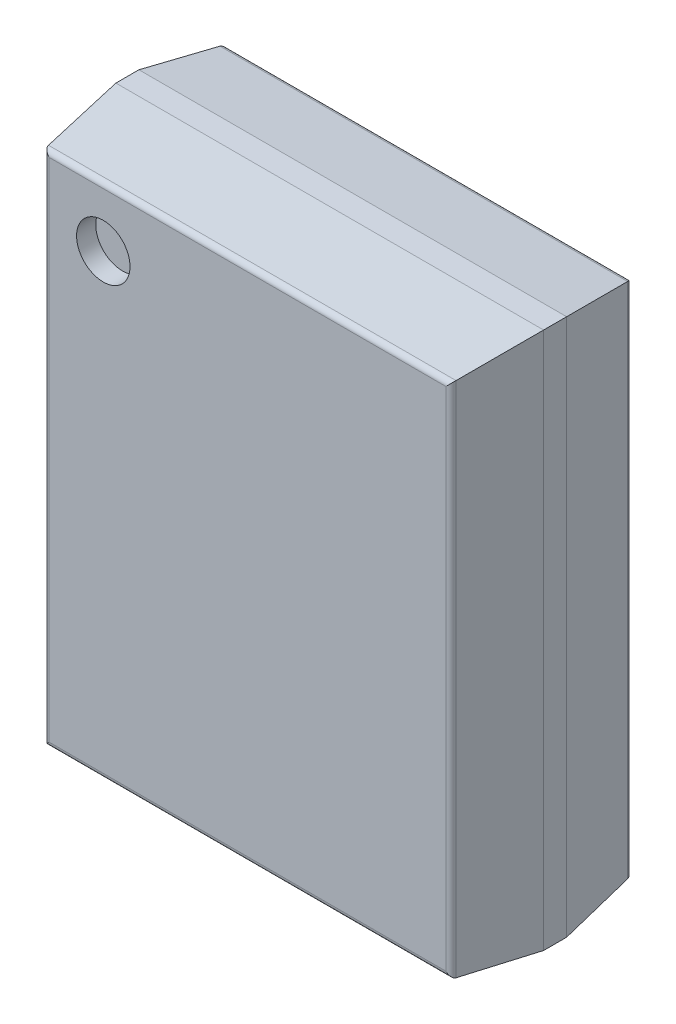
ISO-10303-21;
HEADER;
FILE_DESCRIPTION(('STEP AP214'),'2;1');
FILE_NAME('part.step','',(''),(''),'','','');
FILE_SCHEMA(('AUTOMOTIVE_DESIGN { 1 0 10303 214 1 1 1 1 }'));
ENDSEC;
DATA;
#1=APPLICATION_CONTEXT('core data for automotive mechanical design processes');
#2=APPLICATION_PROTOCOL_DEFINITION('international standard','automotive_design',2000,#1);
#3=PRODUCT_CONTEXT('',#1,'mechanical');
#4=PRODUCT('Part','Part','',(#3));
#5=PRODUCT_RELATED_PRODUCT_CATEGORY('part','',(#4));
#6=PRODUCT_DEFINITION_FORMATION('','',#4);
#7=PRODUCT_DEFINITION_CONTEXT('part definition',#1,'design');
#8=PRODUCT_DEFINITION('design','',#6,#7);
#9=PRODUCT_DEFINITION_SHAPE('','',#8);
#10=(LENGTH_UNIT() NAMED_UNIT(*) SI_UNIT(.MILLI.,.METRE.));
#11=(NAMED_UNIT(*) PLANE_ANGLE_UNIT() SI_UNIT($,.RADIAN.));
#12=(NAMED_UNIT(*) SI_UNIT($,.STERADIAN.) SOLID_ANGLE_UNIT());
#13=UNCERTAINTY_MEASURE_WITH_UNIT(LENGTH_MEASURE(1.E-05),#10,'distance_accuracy_value','');
#14=(GEOMETRIC_REPRESENTATION_CONTEXT(3) GLOBAL_UNCERTAINTY_ASSIGNED_CONTEXT((#13)) GLOBAL_UNIT_ASSIGNED_CONTEXT((#10,
#11,#12)) REPRESENTATION_CONTEXT('',''));
#15=CARTESIAN_POINT('',(0.,0.,0.));
#16=DIRECTION('',(0.,0.,1.));
#17=DIRECTION('',(1.,0.,0.));
#18=AXIS2_PLACEMENT_3D('',#15,#16,#17);
#19=CARTESIAN_POINT('',(-1.315,1.815,1.575));
#20=DIRECTION('',(0.,0.,1.));
#21=DIRECTION('',(1.,0.,0.));
#22=AXIS2_PLACEMENT_3D('',#19,#20,#21);
#23=PLANE('',#22);
#24=CARTESIAN_POINT('',(-1.315,1.815,1.575));
#25=DIRECTION('',(0.,0.,1.));
#26=DIRECTION('',(1.,0.,0.));
#27=AXIS2_PLACEMENT_3D('',#24,#25,#26);
#28=CIRCLE('',#27,0.24375);
#29=CARTESIAN_POINT('',(-1.07125,1.815,1.575));
#30=VERTEX_POINT('',#29);
#31=EDGE_CURVE('E20',#30,#30,#28,.T.);
#32=ORIENTED_EDGE('',*,*,#31,.T.);
#33=EDGE_LOOP('',(#32));
#34=FACE_BOUND('',#33,.T.);
#35=ADVANCED_FACE('F17',(#34),#23,.T.);
#36=CARTESIAN_POINT('',(-1.315,1.815,1.575));
#37=DIRECTION('',(0.,0.,1.));
#38=DIRECTION('',(1.,0.,0.));
#39=AXIS2_PLACEMENT_3D('',#36,#37,#38);
#40=CYLINDRICAL_SURFACE('',#39,0.24375);
#41=CARTESIAN_POINT('',(-1.315,1.815,1.75));
#42=DIRECTION('',(0.,0.,1.));
#43=DIRECTION('',(1.,0.,0.));
#44=AXIS2_PLACEMENT_3D('',#41,#42,#43);
#45=CIRCLE('',#44,0.24375);
#46=CARTESIAN_POINT('',(-1.07125,1.815,1.75));
#47=VERTEX_POINT('',#46);
#48=EDGE_CURVE('E100',#47,#47,#45,.F.);
#49=ORIENTED_EDGE('',*,*,#48,.F.);
#50=EDGE_LOOP('',(#49));
#51=FACE_BOUND('',#50,.T.);
#52=ORIENTED_EDGE('',*,*,#31,.F.);
#53=EDGE_LOOP('',(#52));
#54=FACE_BOUND('',#53,.T.);
#55=ADVANCED_FACE('F117',(#51,#54),#40,.F.);
#56=CARTESIAN_POINT('',(-1.95,-2.45,1.75));
#57=DIRECTION('',(0.,0.,1.));
#58=DIRECTION('',(1.,0.,0.));
#59=AXIS2_PLACEMENT_3D('',#56,#57,#58);
#60=PLANE('',#59);
#61=ORIENTED_EDGE('',*,*,#48,.T.);
#62=EDGE_LOOP('',(#61));
#63=FACE_BOUND('',#62,.T.);
#64=DIRECTION('',(0.,1.,0.));
#65=VECTOR('',#64,1.);
#66=CARTESIAN_POINT('',(1.808580992189,-2.3525,1.75));
#67=LINE('',#66,#65);
#68=CARTESIAN_POINT('',(1.808580992189,2.308580992189,1.75));
#69=VERTEX_POINT('',#68);
#70=CARTESIAN_POINT('',(1.808580992189,-2.308580992189,1.75));
#71=VERTEX_POINT('',#70);
#72=EDGE_CURVE('E107',#69,#71,#67,.F.);
#73=ORIENTED_EDGE('',*,*,#72,.F.);
#74=DIRECTION('',(1.,0.,0.));
#75=VECTOR('',#74,1.);
#76=CARTESIAN_POINT('',(-1.8525,2.308580992189,1.75));
#77=LINE('',#76,#75);
#78=CARTESIAN_POINT('',(-1.808580992189,2.308580992189,1.75));
#79=VERTEX_POINT('',#78);
#80=EDGE_CURVE('E96',#79,#69,#77,.T.);
#81=ORIENTED_EDGE('',*,*,#80,.F.);
#82=DIRECTION('',(0.,1.,0.));
#83=VECTOR('',#82,1.);
#84=CARTESIAN_POINT('',(-1.808580992189,-2.3525,1.75));
#85=LINE('',#84,#83);
#86=CARTESIAN_POINT('',(-1.808580992189,-2.308580992189,1.75));
#87=VERTEX_POINT('',#86);
#88=EDGE_CURVE('E92',#87,#79,#85,.T.);
#89=ORIENTED_EDGE('',*,*,#88,.F.);
#90=DIRECTION('',(1.,0.,0.));
#91=VECTOR('',#90,1.);
#92=CARTESIAN_POINT('',(-1.8525,-2.308580992189,1.75));
#93=LINE('',#92,#91);
#94=EDGE_CURVE('E81',#71,#87,#93,.F.);
#95=ORIENTED_EDGE('',*,*,#94,.F.);
#96=EDGE_LOOP('',(#73,#81,#89,#95));
#97=FACE_BOUND('',#96,.T.);
#98=ADVANCED_FACE('F95',(#63,#97),#60,.T.);
#99=CARTESIAN_POINT('',(-1.808580992189,-2.3525,1.7));
#100=DIRECTION('',(0.,1.,0.));
#101=DIRECTION('',(0.,0.,1.));
#102=AXIS2_PLACEMENT_3D('',#99,#100,#101);
#103=CYLINDRICAL_SURFACE('',#102,0.05);
#104=CARTESIAN_POINT('',(-1.808580992189,2.308580992189,1.7));
#105=DIRECTION('',(0.707106781186547,0.707106781186547,0.));
#106=DIRECTION('',(0.707106781186547,-0.707106781186547,0.));
#107=AXIS2_PLACEMENT_3D('',#104,#105,#106);
#108=ELLIPSE('',#107,0.0707106781186548,0.05);
#109=CARTESIAN_POINT('',(-1.85816352239675,2.35816352239655,1.70644768937089));
#110=VERTEX_POINT('',#109);
#111=EDGE_CURVE('E363',#110,#79,#108,.T.);
#112=ORIENTED_EDGE('',*,*,#111,.F.);
#113=DIRECTION('',(0.,1.,0.));
#114=VECTOR('',#113,1.);
#115=CARTESIAN_POINT('',(-1.8581635223966,-2.45,1.70644768937095));
#116=LINE('',#115,#114);
#117=CARTESIAN_POINT('',(-1.85816352239675,-2.35816352239655,1.70644768937089));
#118=VERTEX_POINT('',#117);
#119=EDGE_CURVE('E104',#110,#118,#116,.F.);
#120=ORIENTED_EDGE('',*,*,#119,.T.);
#121=CARTESIAN_POINT('',(-1.808580992189,-2.308580992189,1.7));
#122=DIRECTION('',(0.707106781186547,-0.707106781186547,0.));
#123=DIRECTION('',(0.707106781186547,0.707106781186547,0.));
#124=AXIS2_PLACEMENT_3D('',#121,#122,#123);
#125=ELLIPSE('',#124,0.0707106781186548,0.05);
#126=EDGE_CURVE('E86',#87,#118,#125,.T.);
#127=ORIENTED_EDGE('',*,*,#126,.F.);
#128=ORIENTED_EDGE('',*,*,#88,.T.);
#129=EDGE_LOOP('',(#112,#120,#127,#128));
#130=FACE_BOUND('',#129,.T.);
#131=ADVANCED_FACE('F103',(#130),#103,.T.);
#132=CARTESIAN_POINT('',(-1.8525,-2.308580992189,1.7));
#133=DIRECTION('',(1.,0.,0.));
#134=DIRECTION('',(0.,0.,-1.));
#135=AXIS2_PLACEMENT_3D('',#132,#133,#134);
#136=CYLINDRICAL_SURFACE('',#135,0.05);
#137=ORIENTED_EDGE('',*,*,#94,.T.);
#138=ORIENTED_EDGE('',*,*,#126,.T.);
#139=DIRECTION('',(1.,0.,0.));
#140=VECTOR('',#139,1.);
#141=CARTESIAN_POINT('',(-1.95,-2.3581635223966,1.70644768937095));
#142=LINE('',#141,#140);
#143=CARTESIAN_POINT('',(1.85816352239655,-2.35816352239675,1.70644768937089));
#144=VERTEX_POINT('',#143);
#145=EDGE_CURVE('E380',#118,#144,#142,.T.);
#146=ORIENTED_EDGE('',*,*,#145,.T.);
#147=CARTESIAN_POINT('',(1.808580992189,-2.308580992189,1.7));
#148=DIRECTION('',(0.707106781186547,0.707106781186547,0.));
#149=DIRECTION('',(-0.707106781186547,0.707106781186547,0.));
#150=AXIS2_PLACEMENT_3D('',#147,#148,#149);
#151=ELLIPSE('',#150,0.0707106781186548,0.05);
#152=EDGE_CURVE('E88',#71,#144,#151,.T.);
#153=ORIENTED_EDGE('',*,*,#152,.F.);
#154=EDGE_LOOP('',(#137,#138,#146,#153));
#155=FACE_BOUND('',#154,.T.);
#156=ADVANCED_FACE('F83',(#155),#136,.T.);
#157=CARTESIAN_POINT('',(1.808580992189,-2.3525,1.7));
#158=DIRECTION('',(0.,1.,0.));
#159=DIRECTION('',(0.,0.,1.));
#160=AXIS2_PLACEMENT_3D('',#157,#158,#159);
#161=CYLINDRICAL_SURFACE('',#160,0.05);
#162=CARTESIAN_POINT('',(1.808580992189,2.308580992189,1.7));
#163=DIRECTION('',(0.707106781186547,-0.707106781186547,0.));
#164=DIRECTION('',(0.707106781186547,0.707106781186547,0.));
#165=AXIS2_PLACEMENT_3D('',#162,#163,#164);
#166=ELLIPSE('',#165,0.0707106781186548,0.05);
#167=CARTESIAN_POINT('',(1.85816352239675,2.35816352239655,1.70644768937089));
#168=VERTEX_POINT('',#167);
#169=EDGE_CURVE('E357',#69,#168,#166,.F.);
#170=ORIENTED_EDGE('',*,*,#169,.F.);
#171=ORIENTED_EDGE('',*,*,#72,.T.);
#172=ORIENTED_EDGE('',*,*,#152,.T.);
#173=DIRECTION('',(0.,1.,0.));
#174=VECTOR('',#173,1.);
#175=CARTESIAN_POINT('',(1.8581635223966,-2.45,1.70644768937095));
#176=LINE('',#175,#174);
#177=EDGE_CURVE('E359',#168,#144,#176,.F.);
#178=ORIENTED_EDGE('',*,*,#177,.F.);
#179=EDGE_LOOP('',(#170,#171,#172,#178));
#180=FACE_BOUND('',#179,.T.);
#181=ADVANCED_FACE('F200',(#180),#161,.T.);
#182=CARTESIAN_POINT('',(-1.8525,2.308580992189,1.7));
#183=DIRECTION('',(1.,0.,0.));
#184=DIRECTION('',(0.,0.,-1.));
#185=AXIS2_PLACEMENT_3D('',#182,#183,#184);
#186=CYLINDRICAL_SURFACE('',#185,0.05);
#187=DIRECTION('',(1.,0.,0.));
#188=VECTOR('',#187,1.);
#189=CARTESIAN_POINT('',(-1.95,2.3581635223966,1.70644768937095));
#190=LINE('',#189,#188);
#191=EDGE_CURVE('E385',#110,#168,#190,.T.);
#192=ORIENTED_EDGE('',*,*,#191,.F.);
#193=ORIENTED_EDGE('',*,*,#111,.T.);
#194=ORIENTED_EDGE('',*,*,#80,.T.);
#195=ORIENTED_EDGE('',*,*,#169,.T.);
#196=EDGE_LOOP('',(#192,#193,#194,#195));
#197=FACE_BOUND('',#196,.T.);
#198=ADVANCED_FACE('F196',(#197),#186,.T.);
#199=CARTESIAN_POINT('',(-1.90125,-2.45,1.37511402014));
#200=DIRECTION('',(0.991650604149877,0.,-0.128953787416984));
#201=DIRECTION('',(-0.128953787416984,0.,-0.991650604149877));
#202=AXIS2_PLACEMENT_3D('',#199,#200,#201);
#203=PLANE('',#202);
#204=DIRECTION('',(0.127894785556018,-0.127894785556622,0.983506912865897));
#205=VECTOR('',#204,1.);
#206=CARTESIAN_POINT('',(-1.95,2.45000000000004,1.000228040281));
#207=LINE('',#206,#205);
#208=CARTESIAN_POINT('',(-1.95,2.45000000000001,1.000228040281));
#209=VERTEX_POINT('',#208);
#210=EDGE_CURVE('E408',#209,#110,#207,.T.);
#211=ORIENTED_EDGE('',*,*,#210,.F.);
#212=DIRECTION('',(0.,1.,0.));
#213=VECTOR('',#212,1.);
#214=CARTESIAN_POINT('',(-1.95,-2.45,1.000228040281));
#215=LINE('',#214,#213);
#216=CARTESIAN_POINT('',(-1.95,-2.45000000000001,1.000228040281));
#217=VERTEX_POINT('',#216);
#218=EDGE_CURVE('E426',#209,#217,#215,.F.);
#219=ORIENTED_EDGE('',*,*,#218,.T.);
#220=DIRECTION('',(0.127894785556018,0.127894785556622,0.983506912865897));
#221=VECTOR('',#220,1.);
#222=CARTESIAN_POINT('',(-1.95,-2.45000000000004,1.000228040281));
#223=LINE('',#222,#221);
#224=EDGE_CURVE('E382',#217,#118,#223,.T.);
#225=ORIENTED_EDGE('',*,*,#224,.T.);
#226=ORIENTED_EDGE('',*,*,#119,.F.);
#227=EDGE_LOOP('',(#211,#219,#225,#226));
#228=FACE_BOUND('',#227,.T.);
#229=ADVANCED_FACE('F192',(#228),#203,.F.);
#230=CARTESIAN_POINT('',(-1.95,-2.40125,1.37511402014));
#231=DIRECTION('',(0.,0.991650604149877,-0.128953787416984));
#232=DIRECTION('',(0.,0.128953787416984,0.991650604149877));
#233=AXIS2_PLACEMENT_3D('',#230,#231,#232);
#234=PLANE('',#233);
#235=DIRECTION('',(1.,0.,0.));
#236=VECTOR('',#235,1.);
#237=CARTESIAN_POINT('',(-1.95,-2.45,1.000228040281));
#238=LINE('',#237,#236);
#239=CARTESIAN_POINT('',(1.95000000000001,-2.45,1.000228040281));
#240=VERTEX_POINT('',#239);
#241=EDGE_CURVE('E395',#217,#240,#238,.T.);
#242=ORIENTED_EDGE('',*,*,#241,.T.);
#243=DIRECTION('',(0.127894785556622,-0.127894785556018,-0.983506912865896));
#244=VECTOR('',#243,1.);
#245=CARTESIAN_POINT('',(1.8581635223966,-2.358163522397,1.70644768937095));
#246=LINE('',#245,#244);
#247=EDGE_CURVE('E386',#144,#240,#246,.T.);
#248=ORIENTED_EDGE('',*,*,#247,.F.);
#249=ORIENTED_EDGE('',*,*,#145,.F.);
#250=ORIENTED_EDGE('',*,*,#224,.F.);
#251=EDGE_LOOP('',(#242,#248,#249,#250));
#252=FACE_BOUND('',#251,.T.);
#253=ADVANCED_FACE('F188',(#252),#234,.F.);
#254=CARTESIAN_POINT('',(1.90125,-2.45,1.37511402014));
#255=DIRECTION('',(0.991650604149877,0.,0.128953787416984));
#256=DIRECTION('',(0.128953787416984,0.,-0.991650604149877));
#257=AXIS2_PLACEMENT_3D('',#254,#255,#256);
#258=PLANE('',#257);
#259=DIRECTION('',(0.127894785556018,0.127894785556621,-0.983506912865896));
#260=VECTOR('',#259,1.);
#261=CARTESIAN_POINT('',(1.858163522397,2.3581635223966,1.70644768937095));
#262=LINE('',#261,#260);
#263=CARTESIAN_POINT('',(1.95,2.45000000000001,1.000228040281));
#264=VERTEX_POINT('',#263);
#265=EDGE_CURVE('E388',#168,#264,#262,.T.);
#266=ORIENTED_EDGE('',*,*,#265,.F.);
#267=ORIENTED_EDGE('',*,*,#177,.T.);
#268=ORIENTED_EDGE('',*,*,#247,.T.);
#269=DIRECTION('',(0.,1.,0.));
#270=VECTOR('',#269,1.);
#271=CARTESIAN_POINT('',(1.95,-2.45,1.000228040281));
#272=LINE('',#271,#270);
#273=EDGE_CURVE('E411',#264,#240,#272,.F.);
#274=ORIENTED_EDGE('',*,*,#273,.F.);
#275=EDGE_LOOP('',(#266,#267,#268,#274));
#276=FACE_BOUND('',#275,.T.);
#277=ADVANCED_FACE('F184',(#276),#258,.T.);
#278=CARTESIAN_POINT('',(-1.95,2.40125,1.37511402014));
#279=DIRECTION('',(0.,0.991650604149877,0.128953787416984));
#280=DIRECTION('',(0.,-0.128953787416984,0.991650604149877));
#281=AXIS2_PLACEMENT_3D('',#278,#279,#280);
#282=PLANE('',#281);
#283=DIRECTION('',(1.,0.,0.));
#284=VECTOR('',#283,1.);
#285=CARTESIAN_POINT('',(-1.95,2.45,1.000228040281));
#286=LINE('',#285,#284);
#287=EDGE_CURVE('E417',#209,#264,#286,.T.);
#288=ORIENTED_EDGE('',*,*,#287,.F.);
#289=ORIENTED_EDGE('',*,*,#210,.T.);
#290=ORIENTED_EDGE('',*,*,#191,.T.);
#291=ORIENTED_EDGE('',*,*,#265,.T.);
#292=EDGE_LOOP('',(#288,#289,#290,#291));
#293=FACE_BOUND('',#292,.T.);
#294=ADVANCED_FACE('F180',(#293),#282,.T.);
#295=CARTESIAN_POINT('',(-1.95,-2.45,0.1));
#296=DIRECTION('',(1.,0.,0.));
#297=DIRECTION('',(0.,0.,-1.));
#298=AXIS2_PLACEMENT_3D('',#295,#296,#297);
#299=PLANE('',#298);
#300=DIRECTION('',(0.,0.,1.));
#301=VECTOR('',#300,1.);
#302=CARTESIAN_POINT('',(-1.95,2.45,0.1));
#303=LINE('',#302,#301);
#304=CARTESIAN_POINT('',(-1.95000000000001,2.45000000000003,0.790228040280996));
#305=VERTEX_POINT('',#304);
#306=EDGE_CURVE('E421',#305,#209,#303,.T.);
#307=ORIENTED_EDGE('',*,*,#306,.F.);
#308=DIRECTION('',(0.,1.,0.));
#309=VECTOR('',#308,1.);
#310=CARTESIAN_POINT('',(-1.95000000000004,-2.45,0.790228040280994));
#311=LINE('',#310,#309);
#312=CARTESIAN_POINT('',(-1.95000000000001,-2.45000000000002,0.790228040280996));
#313=VERTEX_POINT('',#312);
#314=EDGE_CURVE('E420',#313,#305,#311,.T.);
#315=ORIENTED_EDGE('',*,*,#314,.F.);
#316=DIRECTION('',(0.,0.,1.));
#317=VECTOR('',#316,1.);
#318=CARTESIAN_POINT('',(-1.95,-2.45,0.1));
#319=LINE('',#318,#317);
#320=EDGE_CURVE('E399',#313,#217,#319,.T.);
#321=ORIENTED_EDGE('',*,*,#320,.T.);
#322=ORIENTED_EDGE('',*,*,#218,.F.);
#323=EDGE_LOOP('',(#307,#315,#321,#322));
#324=FACE_BOUND('',#323,.T.);
#325=ADVANCED_FACE('F176',(#324),#299,.F.);
#326=CARTESIAN_POINT('',(-1.95,-2.45,0.1));
#327=DIRECTION('',(0.,1.,0.));
#328=DIRECTION('',(0.,0.,1.));
#329=AXIS2_PLACEMENT_3D('',#326,#327,#328);
#330=PLANE('',#329);
#331=ORIENTED_EDGE('',*,*,#320,.F.);
#332=DIRECTION('',(1.,0.,0.));
#333=VECTOR('',#332,1.);
#334=CARTESIAN_POINT('',(-1.95,-2.45000000000004,0.790228040280995));
#335=LINE('',#334,#333);
#336=CARTESIAN_POINT('',(1.95000000000002,-2.45000000000001,0.790228040280994));
#337=VERTEX_POINT('',#336);
#338=EDGE_CURVE('E437',#337,#313,#335,.F.);
#339=ORIENTED_EDGE('',*,*,#338,.F.);
#340=DIRECTION('',(0.,0.,-1.));
#341=VECTOR('',#340,1.);
#342=CARTESIAN_POINT('',(1.95,-2.45,0.1));
#343=LINE('',#342,#341);
#344=EDGE_CURVE('E398',#240,#337,#343,.T.);
#345=ORIENTED_EDGE('',*,*,#344,.F.);
#346=ORIENTED_EDGE('',*,*,#241,.F.);
#347=EDGE_LOOP('',(#331,#339,#345,#346));
#348=FACE_BOUND('',#347,.T.);
#349=ADVANCED_FACE('F172',(#348),#330,.F.);
#350=CARTESIAN_POINT('',(1.95,-2.45,0.1));
#351=DIRECTION('',(1.,0.,0.));
#352=DIRECTION('',(0.,0.,-1.));
#353=AXIS2_PLACEMENT_3D('',#350,#351,#352);
#354=PLANE('',#353);
#355=DIRECTION('',(0.,0.,1.));
#356=VECTOR('',#355,1.);
#357=CARTESIAN_POINT('',(1.95,2.45,0.1));
#358=LINE('',#357,#356);
#359=CARTESIAN_POINT('',(1.95000000000001,2.45000000000002,0.790228040280995));
#360=VERTEX_POINT('',#359);
#361=EDGE_CURVE('E414',#264,#360,#358,.F.);
#362=ORIENTED_EDGE('',*,*,#361,.F.);
#363=ORIENTED_EDGE('',*,*,#273,.T.);
#364=ORIENTED_EDGE('',*,*,#344,.T.);
#365=DIRECTION('',(0.,1.,0.));
#366=VECTOR('',#365,1.);
#367=CARTESIAN_POINT('',(1.95000000000004,-2.45,0.790228040280994));
#368=LINE('',#367,#366);
#369=EDGE_CURVE('E447',#337,#360,#368,.T.);
#370=ORIENTED_EDGE('',*,*,#369,.T.);
#371=EDGE_LOOP('',(#362,#363,#364,#370));
#372=FACE_BOUND('',#371,.T.);
#373=ADVANCED_FACE('F168',(#372),#354,.T.);
#374=CARTESIAN_POINT('',(-1.95,2.45,0.1));
#375=DIRECTION('',(0.,1.,0.));
#376=DIRECTION('',(0.,0.,1.));
#377=AXIS2_PLACEMENT_3D('',#374,#375,#376);
#378=PLANE('',#377);
#379=ORIENTED_EDGE('',*,*,#306,.T.);
#380=ORIENTED_EDGE('',*,*,#287,.T.);
#381=ORIENTED_EDGE('',*,*,#361,.T.);
#382=DIRECTION('',(1.,0.,0.));
#383=VECTOR('',#382,1.);
#384=CARTESIAN_POINT('',(-1.95,2.45000000000004,0.790228040280995));
#385=LINE('',#384,#383);
#386=EDGE_CURVE('E462',#360,#305,#385,.F.);
#387=ORIENTED_EDGE('',*,*,#386,.T.);
#388=EDGE_LOOP('',(#379,#380,#381,#387));
#389=FACE_BOUND('',#388,.T.);
#390=ADVANCED_FACE('F164',(#389),#378,.T.);
#391=CARTESIAN_POINT('',(-1.90125,-2.45,0.44511402014));
#392=DIRECTION('',(-0.990170002910925,0.,-0.139869100716989));
#393=DIRECTION('',(-0.139869100716989,0.,0.990170002910925));
#394=AXIS2_PLACEMENT_3D('',#391,#392,#393);
#395=PLANE('',#394);
#396=DIRECTION('',(0.138520698086421,-0.138520698086181,-0.980624307471199));
#397=VECTOR('',#396,1.);
#398=CARTESIAN_POINT('',(-1.95,2.45000000000004,0.790228040280995));
#399=LINE('',#398,#397);
#400=CARTESIAN_POINT('',(-1.85857500404127,2.35857500404145,0.143006544964047));
#401=VERTEX_POINT('',#400);
#402=EDGE_CURVE('E465',#305,#401,#399,.T.);
#403=ORIENTED_EDGE('',*,*,#402,.T.);
#404=DIRECTION('',(0.,1.,0.));
#405=VECTOR('',#404,1.);
#406=CARTESIAN_POINT('',(-1.85857500404151,-2.3525,0.143006544963927));
#407=LINE('',#406,#405);
#408=CARTESIAN_POINT('',(-1.85857500404127,-2.35857500404145,0.143006544964047));
#409=VERTEX_POINT('',#408);
#410=EDGE_CURVE('E370',#409,#401,#407,.T.);
#411=ORIENTED_EDGE('',*,*,#410,.F.);
#412=DIRECTION('',(0.138520698086421,0.138520698086181,-0.980624307471199));
#413=VECTOR('',#412,1.);
#414=CARTESIAN_POINT('',(-1.95,-2.45000000000004,0.790228040280995));
#415=LINE('',#414,#413);
#416=EDGE_CURVE('E440',#313,#409,#415,.T.);
#417=ORIENTED_EDGE('',*,*,#416,.F.);
#418=ORIENTED_EDGE('',*,*,#314,.T.);
#419=EDGE_LOOP('',(#403,#411,#417,#418));
#420=FACE_BOUND('',#419,.T.);
#421=ADVANCED_FACE('F160',(#420),#395,.T.);
#422=CARTESIAN_POINT('',(-1.95,-2.40125,0.44511402014));
#423=DIRECTION('',(0.,-0.990170002910925,-0.139869100716989));
#424=DIRECTION('',(0.,0.139869100716989,-0.990170002910925));
#425=AXIS2_PLACEMENT_3D('',#422,#423,#424);
#426=PLANE('',#425);
#427=ORIENTED_EDGE('',*,*,#338,.T.);
#428=ORIENTED_EDGE('',*,*,#416,.T.);
#429=DIRECTION('',(1.,0.,0.));
#430=VECTOR('',#429,1.);
#431=CARTESIAN_POINT('',(-1.8525,-2.35857500404151,0.143006544963927));
#432=LINE('',#431,#430);
#433=CARTESIAN_POINT('',(1.85857500404145,-2.35857500404127,0.143006544964047));
#434=VERTEX_POINT('',#433);
#435=EDGE_CURVE('E369',#434,#409,#432,.F.);
#436=ORIENTED_EDGE('',*,*,#435,.F.);
#437=DIRECTION('',(0.138520698086181,-0.138520698086422,0.980624307471198));
#438=VECTOR('',#437,1.);
#439=CARTESIAN_POINT('',(1.8585750040412,-2.358575004041,0.143006544963972));
#440=LINE('',#439,#438);
#441=EDGE_CURVE('E451',#434,#337,#440,.T.);
#442=ORIENTED_EDGE('',*,*,#441,.T.);
#443=EDGE_LOOP('',(#427,#428,#436,#442));
#444=FACE_BOUND('',#443,.T.);
#445=ADVANCED_FACE('F156',(#444),#426,.T.);
#446=CARTESIAN_POINT('',(1.90125,-2.45,0.44511402014));
#447=DIRECTION('',(-0.990170002910925,0.,0.139869100716989));
#448=DIRECTION('',(0.139869100716989,0.,0.990170002910925));
#449=AXIS2_PLACEMENT_3D('',#446,#447,#448);
#450=PLANE('',#449);
#451=DIRECTION('',(0.138520698086421,0.138520698086181,0.980624307471199));
#452=VECTOR('',#451,1.);
#453=CARTESIAN_POINT('',(1.858575004041,2.3585750040412,0.143006544963972));
#454=LINE('',#453,#452);
#455=CARTESIAN_POINT('',(1.85857500404127,2.35857500404145,0.143006544964047));
#456=VERTEX_POINT('',#455);
#457=EDGE_CURVE('E450',#456,#360,#454,.T.);
#458=ORIENTED_EDGE('',*,*,#457,.T.);
#459=ORIENTED_EDGE('',*,*,#369,.F.);
#460=ORIENTED_EDGE('',*,*,#441,.F.);
#461=DIRECTION('',(0.,1.,0.));
#462=VECTOR('',#461,1.);
#463=CARTESIAN_POINT('',(1.85857500404151,-2.3525,0.143006544963927));
#464=LINE('',#463,#462);
#465=EDGE_CURVE('E374',#456,#434,#464,.F.);
#466=ORIENTED_EDGE('',*,*,#465,.F.);
#467=EDGE_LOOP('',(#458,#459,#460,#466));
#468=FACE_BOUND('',#467,.T.);
#469=ADVANCED_FACE('F152',(#468),#450,.F.);
#470=CARTESIAN_POINT('',(-1.95,2.40125,0.44511402014));
#471=DIRECTION('',(0.,-0.990170002910925,0.139869100716989));
#472=DIRECTION('',(0.,-0.139869100716989,-0.990170002910925));
#473=AXIS2_PLACEMENT_3D('',#470,#471,#472);
#474=PLANE('',#473);
#475=ORIENTED_EDGE('',*,*,#386,.F.);
#476=ORIENTED_EDGE('',*,*,#457,.F.);
#477=DIRECTION('',(1.,0.,0.));
#478=VECTOR('',#477,1.);
#479=CARTESIAN_POINT('',(-1.8525,2.35857500404151,0.143006544963927));
#480=LINE('',#479,#478);
#481=EDGE_CURVE('E377',#401,#456,#480,.T.);
#482=ORIENTED_EDGE('',*,*,#481,.F.);
#483=ORIENTED_EDGE('',*,*,#402,.F.);
#484=EDGE_LOOP('',(#475,#476,#482,#483));
#485=FACE_BOUND('',#484,.T.);
#486=ADVANCED_FACE('F148',(#485),#474,.F.);
#487=CARTESIAN_POINT('',(-1.809066503896,-2.3525,0.15));
#488=DIRECTION('',(0.,1.,0.));
#489=DIRECTION('',(0.,0.,1.));
#490=AXIS2_PLACEMENT_3D('',#487,#488,#489);
#491=CYLINDRICAL_SURFACE('',#490,0.05);
#492=DIRECTION('',(0.,1.,0.));
#493=VECTOR('',#492,1.);
#494=CARTESIAN_POINT('',(-1.809066503896,-2.45,0.1));
#495=LINE('',#494,#493);
#496=CARTESIAN_POINT('',(-1.809066503896,2.309066503896,0.1));
#497=VERTEX_POINT('',#496);
#498=CARTESIAN_POINT('',(-1.809066503896,-2.309066503896,0.1));
#499=VERTEX_POINT('',#498);
#500=EDGE_CURVE('E378',#497,#499,#495,.F.);
#501=ORIENTED_EDGE('',*,*,#500,.T.);
#502=CARTESIAN_POINT('',(-1.809066503896,-2.309066503896,0.15));
#503=DIRECTION('',(0.707106781186547,-0.707106781186547,0.));
#504=DIRECTION('',(0.707106781186547,0.707106781186547,0.));
#505=AXIS2_PLACEMENT_3D('',#502,#503,#504);
#506=ELLIPSE('',#505,0.0707106781186548,0.05);
#507=EDGE_CURVE('E367',#409,#499,#506,.T.);
#508=ORIENTED_EDGE('',*,*,#507,.F.);
#509=ORIENTED_EDGE('',*,*,#410,.T.);
#510=CARTESIAN_POINT('',(-1.809066503896,2.309066503896,0.15));
#511=DIRECTION('',(0.707106781186547,0.707106781186547,0.));
#512=DIRECTION('',(0.707106781186547,-0.707106781186547,0.));
#513=AXIS2_PLACEMENT_3D('',#510,#511,#512);
#514=ELLIPSE('',#513,0.0707106781186548,0.05);
#515=EDGE_CURVE('E373',#497,#401,#514,.T.);
#516=ORIENTED_EDGE('',*,*,#515,.F.);
#517=EDGE_LOOP('',(#501,#508,#509,#516));
#518=FACE_BOUND('',#517,.T.);
#519=ADVANCED_FACE('F144',(#518),#491,.T.);
#520=CARTESIAN_POINT('',(-1.8525,-2.309066503896,0.15));
#521=DIRECTION('',(1.,0.,0.));
#522=DIRECTION('',(0.,0.,-1.));
#523=AXIS2_PLACEMENT_3D('',#520,#521,#522);
#524=CYLINDRICAL_SURFACE('',#523,0.05);
#525=CARTESIAN_POINT('',(1.809066503896,-2.309066503896,0.15));
#526=DIRECTION('',(0.707106781186547,0.707106781186547,0.));
#527=DIRECTION('',(-0.707106781186547,0.707106781186547,0.));
#528=AXIS2_PLACEMENT_3D('',#525,#526,#527);
#529=ELLIPSE('',#528,0.0707106781186548,0.05);
#530=CARTESIAN_POINT('',(1.809066503896,-2.309066503896,0.1));
#531=VERTEX_POINT('',#530);
#532=EDGE_CURVE('E371',#434,#531,#529,.T.);
#533=ORIENTED_EDGE('',*,*,#532,.F.);
#534=ORIENTED_EDGE('',*,*,#435,.T.);
#535=ORIENTED_EDGE('',*,*,#507,.T.);
#536=DIRECTION('',(1.,0.,0.));
#537=VECTOR('',#536,1.);
#538=CARTESIAN_POINT('',(-1.95,-2.309066503896,0.1));
#539=LINE('',#538,#537);
#540=EDGE_CURVE('E488',#499,#531,#539,.T.);
#541=ORIENTED_EDGE('',*,*,#540,.T.);
#542=EDGE_LOOP('',(#533,#534,#535,#541));
#543=FACE_BOUND('',#542,.T.);
#544=ADVANCED_FACE('F140',(#543),#524,.T.);
#545=CARTESIAN_POINT('',(1.809066503896,-2.3525,0.15));
#546=DIRECTION('',(0.,1.,0.));
#547=DIRECTION('',(0.,0.,1.));
#548=AXIS2_PLACEMENT_3D('',#545,#546,#547);
#549=CYLINDRICAL_SURFACE('',#548,0.05);
#550=ORIENTED_EDGE('',*,*,#465,.T.);
#551=ORIENTED_EDGE('',*,*,#532,.T.);
#552=DIRECTION('',(0.,1.,0.));
#553=VECTOR('',#552,1.);
#554=CARTESIAN_POINT('',(1.809066503896,-2.45,0.1));
#555=LINE('',#554,#553);
#556=CARTESIAN_POINT('',(1.809066503896,2.309066503896,0.1));
#557=VERTEX_POINT('',#556);
#558=EDGE_CURVE('E26',#531,#557,#555,.T.);
#559=ORIENTED_EDGE('',*,*,#558,.T.);
#560=CARTESIAN_POINT('',(1.809066503896,2.309066503896,0.15));
#561=DIRECTION('',(0.707106781186547,-0.707106781186547,0.));
#562=DIRECTION('',(0.707106781186547,0.707106781186547,0.));
#563=AXIS2_PLACEMENT_3D('',#560,#561,#562);
#564=ELLIPSE('',#563,0.0707106781186548,0.05);
#565=EDGE_CURVE('E34',#456,#557,#564,.F.);
#566=ORIENTED_EDGE('',*,*,#565,.F.);
#567=EDGE_LOOP('',(#550,#551,#559,#566));
#568=FACE_BOUND('',#567,.T.);
#569=ADVANCED_FACE('F134',(#568),#549,.T.);
#570=CARTESIAN_POINT('',(-1.8525,2.309066503896,0.15));
#571=DIRECTION('',(1.,0.,0.));
#572=DIRECTION('',(0.,0.,-1.));
#573=AXIS2_PLACEMENT_3D('',#570,#571,#572);
#574=CYLINDRICAL_SURFACE('',#573,0.05);
#575=ORIENTED_EDGE('',*,*,#565,.T.);
#576=DIRECTION('',(1.,0.,0.));
#577=VECTOR('',#576,1.);
#578=CARTESIAN_POINT('',(-1.95,2.309066503896,0.1));
#579=LINE('',#578,#577);
#580=EDGE_CURVE('E11',#557,#497,#579,.F.);
#581=ORIENTED_EDGE('',*,*,#580,.T.);
#582=ORIENTED_EDGE('',*,*,#515,.T.);
#583=ORIENTED_EDGE('',*,*,#481,.T.);
#584=EDGE_LOOP('',(#575,#581,#582,#583));
#585=FACE_BOUND('',#584,.T.);
#586=ADVANCED_FACE('F128',(#585),#574,.T.);
#587=CARTESIAN_POINT('',(-1.95,-2.45,0.1));
#588=DIRECTION('',(0.,0.,1.));
#589=DIRECTION('',(1.,0.,0.));
#590=AXIS2_PLACEMENT_3D('',#587,#588,#589);
#591=PLANE('',#590);
#592=ORIENTED_EDGE('',*,*,#558,.F.);
#593=ORIENTED_EDGE('',*,*,#540,.F.);
#594=ORIENTED_EDGE('',*,*,#500,.F.);
#595=ORIENTED_EDGE('',*,*,#580,.F.);
#596=EDGE_LOOP('',(#592,#593,#594,#595));
#597=FACE_BOUND('',#596,.T.);
#598=ADVANCED_FACE('F126',(#597),#591,.F.);
#599=CLOSED_SHELL('',(#35,#55,#98,#131,#156,#181,#198,#229,#253,#277,#294,#325,#349,#373,#390,
#421,#445,#469,#486,#519,#544,#569,#586,#598));
#600=MANIFOLD_SOLID_BREP('B1',#599);
#601=ADVANCED_BREP_SHAPE_REPRESENTATION('',(#18,#600),#14);
#602=SHAPE_DEFINITION_REPRESENTATION(#9,#601);
ENDSEC;
END-ISO-10303-21;
